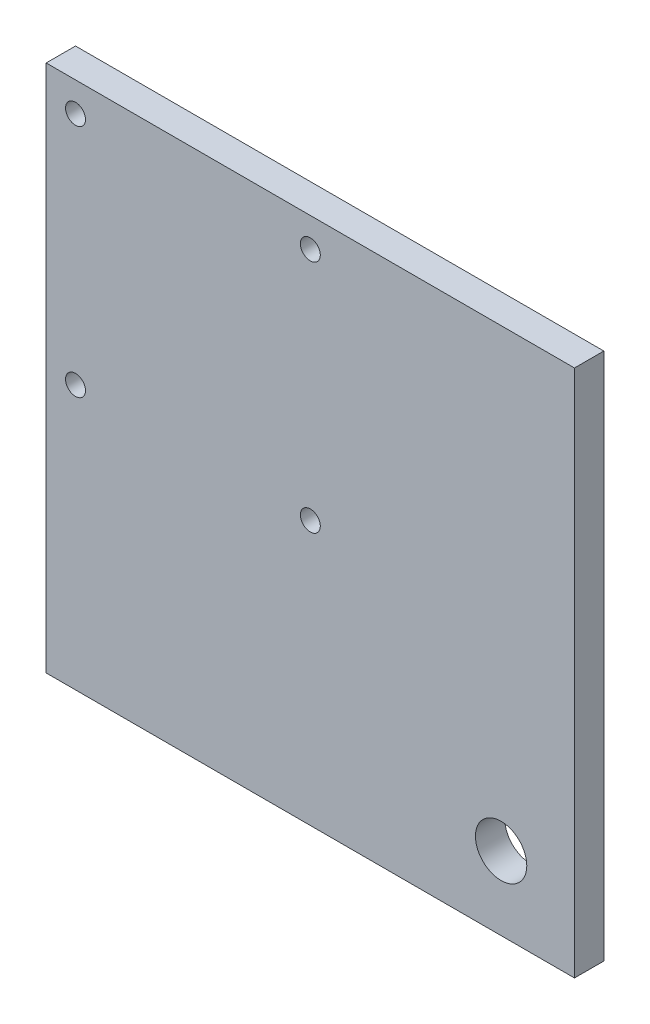
ISO-10303-21;
HEADER;
FILE_DESCRIPTION(('STEP AP214'),'2;1');
FILE_NAME('part.step','',(''),(''),'','','');
FILE_SCHEMA(('AUTOMOTIVE_DESIGN { 1 0 10303 214 1 1 1 1 }'));
ENDSEC;
DATA;
#1=APPLICATION_CONTEXT('core data for automotive mechanical design processes');
#2=APPLICATION_PROTOCOL_DEFINITION('international standard','automotive_design',2000,#1);
#3=PRODUCT_CONTEXT('',#1,'mechanical');
#4=PRODUCT('Part','Part','',(#3));
#5=PRODUCT_RELATED_PRODUCT_CATEGORY('part','',(#4));
#6=PRODUCT_DEFINITION_FORMATION('','',#4);
#7=PRODUCT_DEFINITION_CONTEXT('part definition',#1,'design');
#8=PRODUCT_DEFINITION('design','',#6,#7);
#9=PRODUCT_DEFINITION_SHAPE('','',#8);
#10=(LENGTH_UNIT() NAMED_UNIT(*) SI_UNIT(.MILLI.,.METRE.));
#11=(NAMED_UNIT(*) PLANE_ANGLE_UNIT() SI_UNIT($,.RADIAN.));
#12=(NAMED_UNIT(*) SI_UNIT($,.STERADIAN.) SOLID_ANGLE_UNIT());
#13=UNCERTAINTY_MEASURE_WITH_UNIT(LENGTH_MEASURE(1.E-05),#10,'distance_accuracy_value','');
#14=(GEOMETRIC_REPRESENTATION_CONTEXT(3) GLOBAL_UNCERTAINTY_ASSIGNED_CONTEXT((#13)) GLOBAL_UNIT_ASSIGNED_CONTEXT((#10,
#11,#12)) REPRESENTATION_CONTEXT('',''));
#15=CARTESIAN_POINT('',(0.,0.,0.));
#16=DIRECTION('',(0.,0.,1.));
#17=DIRECTION('',(1.,0.,0.));
#18=AXIS2_PLACEMENT_3D('',#15,#16,#17);
#19=CARTESIAN_POINT('',(0.,0.,10.));
#20=DIRECTION('',(0.,0.,1.));
#21=DIRECTION('',(1.,0.,0.));
#22=AXIS2_PLACEMENT_3D('',#19,#20,#21);
#23=PLANE('',#22);
#24=CARTESIAN_POINT('',(-145.,-79.9999999999994,10.));
#25=DIRECTION('',(0.,0.,1.));
#26=DIRECTION('',(1.,0.,0.));
#27=AXIS2_PLACEMENT_3D('',#24,#25,#26);
#28=CIRCLE('',#27,3.4);
#29=CARTESIAN_POINT('',(-141.6,-79.9999999999994,10.));
#30=VERTEX_POINT('',#29);
#31=EDGE_CURVE('E150',#30,#30,#28,.T.);
#32=ORIENTED_EDGE('',*,*,#31,.F.);
#33=EDGE_LOOP('',(#32));
#34=FACE_BOUND('',#33,.T.);
#35=CARTESIAN_POINT('',(-65.0000000000001,-159.999999999999,10.));
#36=DIRECTION('',(0.,0.,1.));
#37=DIRECTION('',(1.,0.,0.));
#38=AXIS2_PLACEMENT_3D('',#35,#36,#37);
#39=CIRCLE('',#38,3.39999999999998);
#40=CARTESIAN_POINT('',(-61.6000000000002,-159.999999999999,10.));
#41=VERTEX_POINT('',#40);
#42=EDGE_CURVE('E134',#41,#41,#39,.T.);
#43=ORIENTED_EDGE('',*,*,#42,.F.);
#44=EDGE_LOOP('',(#43));
#45=FACE_BOUND('',#44,.T.);
#46=DIRECTION('',(1.,0.,0.));
#47=VECTOR('',#46,1.);
#48=CARTESIAN_POINT('',(-155.,-250.,10.));
#49=LINE('',#48,#47);
#50=CARTESIAN_POINT('',(-155.,-250.,10.));
#51=VERTEX_POINT('',#50);
#52=CARTESIAN_POINT('',(25.,-250.,10.));
#53=VERTEX_POINT('',#52);
#54=EDGE_CURVE('E92',#51,#53,#49,.T.);
#55=ORIENTED_EDGE('',*,*,#54,.T.);
#56=DIRECTION('',(0.,1.,0.));
#57=VECTOR('',#56,1.);
#58=CARTESIAN_POINT('',(25.,-250.,10.));
#59=LINE('',#58,#57);
#60=CARTESIAN_POINT('',(25.,-69.9999999999994,10.));
#61=VERTEX_POINT('',#60);
#62=EDGE_CURVE('E87',#53,#61,#59,.T.);
#63=ORIENTED_EDGE('',*,*,#62,.T.);
#64=DIRECTION('',(-1.,0.,0.));
#65=VECTOR('',#64,1.);
#66=CARTESIAN_POINT('',(25.,-69.9999999999994,10.));
#67=LINE('',#66,#65);
#68=CARTESIAN_POINT('',(-155.,-69.9999999999994,10.));
#69=VERTEX_POINT('',#68);
#70=EDGE_CURVE('E90',#61,#69,#67,.T.);
#71=ORIENTED_EDGE('',*,*,#70,.T.);
#72=DIRECTION('',(0.,-1.,0.));
#73=VECTOR('',#72,1.);
#74=CARTESIAN_POINT('',(-155.,-69.9999999999994,10.));
#75=LINE('',#74,#73);
#76=EDGE_CURVE('E57',#69,#51,#75,.T.);
#77=ORIENTED_EDGE('',*,*,#76,.T.);
#78=EDGE_LOOP('',(#55,#63,#71,#77));
#79=FACE_BOUND('',#78,.T.);
#80=CARTESIAN_POINT('',(-145.,-159.999999999999,10.));
#81=DIRECTION('',(0.,0.,1.));
#82=DIRECTION('',(1.,0.,0.));
#83=AXIS2_PLACEMENT_3D('',#80,#81,#82);
#84=CIRCLE('',#83,3.39999999999999);
#85=CARTESIAN_POINT('',(-141.6,-159.999999999999,10.));
#86=VERTEX_POINT('',#85);
#87=EDGE_CURVE('E112',#86,#86,#84,.T.);
#88=ORIENTED_EDGE('',*,*,#87,.F.);
#89=EDGE_LOOP('',(#88));
#90=FACE_BOUND('',#89,.T.);
#91=CARTESIAN_POINT('',(0.,-225.,10.));
#92=DIRECTION('',(0.,0.,1.));
#93=DIRECTION('',(1.,0.,0.));
#94=AXIS2_PLACEMENT_3D('',#91,#92,#93);
#95=CIRCLE('',#94,8.74999999999999);
#96=CARTESIAN_POINT('',(8.75000000000007,-225.,10.));
#97=VERTEX_POINT('',#96);
#98=EDGE_CURVE('E142',#97,#97,#95,.T.);
#99=ORIENTED_EDGE('',*,*,#98,.F.);
#100=EDGE_LOOP('',(#99));
#101=FACE_BOUND('',#100,.T.);
#102=CARTESIAN_POINT('',(-65.0000000000001,-79.9999999999994,10.));
#103=DIRECTION('',(0.,0.,1.));
#104=DIRECTION('',(1.,0.,0.));
#105=AXIS2_PLACEMENT_3D('',#102,#103,#104);
#106=CIRCLE('',#105,3.39999999999999);
#107=CARTESIAN_POINT('',(-61.6000000000002,-79.9999999999994,10.));
#108=VERTEX_POINT('',#107);
#109=EDGE_CURVE('E158',#108,#108,#106,.T.);
#110=ORIENTED_EDGE('',*,*,#109,.F.);
#111=EDGE_LOOP('',(#110));
#112=FACE_BOUND('',#111,.T.);
#113=ADVANCED_FACE('F39',(#34,#45,#79,#90,#101,#112),#23,.T.);
#114=CARTESIAN_POINT('',(0.,0.,0.));
#115=DIRECTION('',(0.,0.,1.));
#116=DIRECTION('',(1.,0.,0.));
#117=AXIS2_PLACEMENT_3D('',#114,#115,#116);
#118=PLANE('',#117);
#119=DIRECTION('',(1.,0.,0.));
#120=VECTOR('',#119,1.);
#121=CARTESIAN_POINT('',(-155.,-250.,0.));
#122=LINE('',#121,#120);
#123=CARTESIAN_POINT('',(-155.,-250.,0.));
#124=VERTEX_POINT('',#123);
#125=CARTESIAN_POINT('',(25.,-250.,0.));
#126=VERTEX_POINT('',#125);
#127=EDGE_CURVE('E108',#124,#126,#122,.T.);
#128=ORIENTED_EDGE('',*,*,#127,.F.);
#129=DIRECTION('',(0.,-1.,0.));
#130=VECTOR('',#129,1.);
#131=CARTESIAN_POINT('',(-155.,-69.9999999999994,0.));
#132=LINE('',#131,#130);
#133=CARTESIAN_POINT('',(-155.,-69.9999999999994,0.));
#134=VERTEX_POINT('',#133);
#135=EDGE_CURVE('E80',#134,#124,#132,.T.);
#136=ORIENTED_EDGE('',*,*,#135,.F.);
#137=DIRECTION('',(-1.,0.,0.));
#138=VECTOR('',#137,1.);
#139=CARTESIAN_POINT('',(25.,-69.9999999999994,0.));
#140=LINE('',#139,#138);
#141=CARTESIAN_POINT('',(25.,-69.9999999999994,0.));
#142=VERTEX_POINT('',#141);
#143=EDGE_CURVE('E74',#142,#134,#140,.T.);
#144=ORIENTED_EDGE('',*,*,#143,.F.);
#145=DIRECTION('',(0.,1.,0.));
#146=VECTOR('',#145,1.);
#147=CARTESIAN_POINT('',(25.,-250.,0.));
#148=LINE('',#147,#146);
#149=EDGE_CURVE('E97',#126,#142,#148,.T.);
#150=ORIENTED_EDGE('',*,*,#149,.F.);
#151=EDGE_LOOP('',(#128,#136,#144,#150));
#152=FACE_BOUND('',#151,.T.);
#153=CARTESIAN_POINT('',(-145.,-159.999999999999,0.));
#154=DIRECTION('',(0.,0.,1.));
#155=DIRECTION('',(1.,0.,0.));
#156=AXIS2_PLACEMENT_3D('',#153,#154,#155);
#157=CIRCLE('',#156,3.39999999999999);
#158=CARTESIAN_POINT('',(-141.6,-159.999999999999,0.));
#159=VERTEX_POINT('',#158);
#160=EDGE_CURVE('E130',#159,#159,#157,.T.);
#161=ORIENTED_EDGE('',*,*,#160,.T.);
#162=EDGE_LOOP('',(#161));
#163=FACE_BOUND('',#162,.T.);
#164=CARTESIAN_POINT('',(-65.0000000000001,-159.999999999999,0.));
#165=DIRECTION('',(0.,0.,1.));
#166=DIRECTION('',(1.,0.,0.));
#167=AXIS2_PLACEMENT_3D('',#164,#165,#166);
#168=CIRCLE('',#167,3.39999999999998);
#169=CARTESIAN_POINT('',(-61.6000000000002,-159.999999999999,0.));
#170=VERTEX_POINT('',#169);
#171=EDGE_CURVE('E138',#170,#170,#168,.T.);
#172=ORIENTED_EDGE('',*,*,#171,.T.);
#173=EDGE_LOOP('',(#172));
#174=FACE_BOUND('',#173,.T.);
#175=CARTESIAN_POINT('',(0.,-225.,0.));
#176=DIRECTION('',(0.,0.,1.));
#177=DIRECTION('',(1.,0.,0.));
#178=AXIS2_PLACEMENT_3D('',#175,#176,#177);
#179=CIRCLE('',#178,8.74999999999999);
#180=CARTESIAN_POINT('',(8.75000000000007,-225.,0.));
#181=VERTEX_POINT('',#180);
#182=EDGE_CURVE('E146',#181,#181,#179,.T.);
#183=ORIENTED_EDGE('',*,*,#182,.T.);
#184=EDGE_LOOP('',(#183));
#185=FACE_BOUND('',#184,.T.);
#186=CARTESIAN_POINT('',(-145.,-79.9999999999994,0.));
#187=DIRECTION('',(0.,0.,1.));
#188=DIRECTION('',(1.,0.,0.));
#189=AXIS2_PLACEMENT_3D('',#186,#187,#188);
#190=CIRCLE('',#189,3.4);
#191=CARTESIAN_POINT('',(-141.6,-79.9999999999994,0.));
#192=VERTEX_POINT('',#191);
#193=EDGE_CURVE('E154',#192,#192,#190,.T.);
#194=ORIENTED_EDGE('',*,*,#193,.T.);
#195=EDGE_LOOP('',(#194));
#196=FACE_BOUND('',#195,.T.);
#197=CARTESIAN_POINT('',(-65.0000000000001,-79.9999999999994,0.));
#198=DIRECTION('',(0.,0.,1.));
#199=DIRECTION('',(1.,0.,0.));
#200=AXIS2_PLACEMENT_3D('',#197,#198,#199);
#201=CIRCLE('',#200,3.39999999999999);
#202=CARTESIAN_POINT('',(-61.6000000000002,-79.9999999999994,0.));
#203=VERTEX_POINT('',#202);
#204=EDGE_CURVE('E162',#203,#203,#201,.T.);
#205=ORIENTED_EDGE('',*,*,#204,.T.);
#206=EDGE_LOOP('',(#205));
#207=FACE_BOUND('',#206,.T.);
#208=ADVANCED_FACE('F125',(#152,#163,#174,#185,#196,#207),#118,.F.);
#209=CARTESIAN_POINT('',(-155.,-250.,10.));
#210=DIRECTION('',(0.,1.,0.));
#211=DIRECTION('',(0.,0.,1.));
#212=AXIS2_PLACEMENT_3D('',#209,#210,#211);
#213=PLANE('',#212);
#214=ORIENTED_EDGE('',*,*,#127,.T.);
#215=DIRECTION('',(0.,0.,-1.));
#216=VECTOR('',#215,1.);
#217=CARTESIAN_POINT('',(25.,-250.,10.));
#218=LINE('',#217,#216);
#219=EDGE_CURVE('E11',#53,#126,#218,.T.);
#220=ORIENTED_EDGE('',*,*,#219,.F.);
#221=ORIENTED_EDGE('',*,*,#54,.F.);
#222=DIRECTION('',(0.,0.,-1.));
#223=VECTOR('',#222,1.);
#224=CARTESIAN_POINT('',(-155.,-250.,10.));
#225=LINE('',#224,#223);
#226=EDGE_CURVE('E104',#51,#124,#225,.T.);
#227=ORIENTED_EDGE('',*,*,#226,.T.);
#228=EDGE_LOOP('',(#214,#220,#221,#227));
#229=FACE_BOUND('',#228,.T.);
#230=ADVANCED_FACE('F41',(#229),#213,.F.);
#231=CARTESIAN_POINT('',(25.,-250.,10.));
#232=DIRECTION('',(-1.,0.,0.));
#233=DIRECTION('',(0.,-1.,0.));
#234=AXIS2_PLACEMENT_3D('',#231,#232,#233);
#235=PLANE('',#234);
#236=ORIENTED_EDGE('',*,*,#149,.T.);
#237=DIRECTION('',(0.,0.,-1.));
#238=VECTOR('',#237,1.);
#239=CARTESIAN_POINT('',(25.,-69.9999999999994,10.));
#240=LINE('',#239,#238);
#241=EDGE_CURVE('E49',#61,#142,#240,.T.);
#242=ORIENTED_EDGE('',*,*,#241,.F.);
#243=ORIENTED_EDGE('',*,*,#62,.F.);
#244=ORIENTED_EDGE('',*,*,#219,.T.);
#245=EDGE_LOOP('',(#236,#242,#243,#244));
#246=FACE_BOUND('',#245,.T.);
#247=ADVANCED_FACE('F96',(#246),#235,.F.);
#248=CARTESIAN_POINT('',(25.,-69.9999999999994,10.));
#249=DIRECTION('',(0.,-1.,0.));
#250=DIRECTION('',(0.,0.,-1.));
#251=AXIS2_PLACEMENT_3D('',#248,#249,#250);
#252=PLANE('',#251);
#253=ORIENTED_EDGE('',*,*,#143,.T.);
#254=DIRECTION('',(0.,0.,-1.));
#255=VECTOR('',#254,1.);
#256=CARTESIAN_POINT('',(-155.,-69.9999999999994,10.));
#257=LINE('',#256,#255);
#258=EDGE_CURVE('E99',#69,#134,#257,.T.);
#259=ORIENTED_EDGE('',*,*,#258,.F.);
#260=ORIENTED_EDGE('',*,*,#70,.F.);
#261=ORIENTED_EDGE('',*,*,#241,.T.);
#262=EDGE_LOOP('',(#253,#259,#260,#261));
#263=FACE_BOUND('',#262,.T.);
#264=ADVANCED_FACE('F100',(#263),#252,.F.);
#265=CARTESIAN_POINT('',(-155.,-69.9999999999994,10.));
#266=DIRECTION('',(1.,0.,0.));
#267=DIRECTION('',(0.,1.,0.));
#268=AXIS2_PLACEMENT_3D('',#265,#266,#267);
#269=PLANE('',#268);
#270=ORIENTED_EDGE('',*,*,#135,.T.);
#271=ORIENTED_EDGE('',*,*,#226,.F.);
#272=ORIENTED_EDGE('',*,*,#76,.F.);
#273=ORIENTED_EDGE('',*,*,#258,.T.);
#274=EDGE_LOOP('',(#270,#271,#272,#273));
#275=FACE_BOUND('',#274,.T.);
#276=ADVANCED_FACE('F122',(#275),#269,.F.);
#277=CARTESIAN_POINT('',(-145.,-159.999999999999,10.));
#278=DIRECTION('',(0.,0.,-1.));
#279=DIRECTION('',(-1.,0.,0.));
#280=AXIS2_PLACEMENT_3D('',#277,#278,#279);
#281=CYLINDRICAL_SURFACE('',#280,3.39999999999999);
#282=ORIENTED_EDGE('',*,*,#87,.T.);
#283=EDGE_LOOP('',(#282));
#284=FACE_BOUND('',#283,.T.);
#285=ORIENTED_EDGE('',*,*,#160,.F.);
#286=EDGE_LOOP('',(#285));
#287=FACE_BOUND('',#286,.T.);
#288=ADVANCED_FACE('F183',(#284,#287),#281,.F.);
#289=CARTESIAN_POINT('',(-65.0000000000001,-159.999999999999,10.));
#290=DIRECTION('',(0.,0.,-1.));
#291=DIRECTION('',(-1.,0.,0.));
#292=AXIS2_PLACEMENT_3D('',#289,#290,#291);
#293=CYLINDRICAL_SURFACE('',#292,3.39999999999998);
#294=ORIENTED_EDGE('',*,*,#42,.T.);
#295=EDGE_LOOP('',(#294));
#296=FACE_BOUND('',#295,.T.);
#297=ORIENTED_EDGE('',*,*,#171,.F.);
#298=EDGE_LOOP('',(#297));
#299=FACE_BOUND('',#298,.T.);
#300=ADVANCED_FACE('F229',(#296,#299),#293,.F.);
#301=CARTESIAN_POINT('',(0.,-225.,10.));
#302=DIRECTION('',(0.,0.,-1.));
#303=DIRECTION('',(-1.,0.,0.));
#304=AXIS2_PLACEMENT_3D('',#301,#302,#303);
#305=CYLINDRICAL_SURFACE('',#304,8.74999999999999);
#306=ORIENTED_EDGE('',*,*,#98,.T.);
#307=EDGE_LOOP('',(#306));
#308=FACE_BOUND('',#307,.T.);
#309=ORIENTED_EDGE('',*,*,#182,.F.);
#310=EDGE_LOOP('',(#309));
#311=FACE_BOUND('',#310,.T.);
#312=ADVANCED_FACE('F237',(#308,#311),#305,.F.);
#313=CARTESIAN_POINT('',(-145.,-79.9999999999994,10.));
#314=DIRECTION('',(0.,0.,-1.));
#315=DIRECTION('',(-1.,0.,0.));
#316=AXIS2_PLACEMENT_3D('',#313,#314,#315);
#317=CYLINDRICAL_SURFACE('',#316,3.4);
#318=ORIENTED_EDGE('',*,*,#31,.T.);
#319=EDGE_LOOP('',(#318));
#320=FACE_BOUND('',#319,.T.);
#321=ORIENTED_EDGE('',*,*,#193,.F.);
#322=EDGE_LOOP('',(#321));
#323=FACE_BOUND('',#322,.T.);
#324=ADVANCED_FACE('F245',(#320,#323),#317,.F.);
#325=CARTESIAN_POINT('',(-65.0000000000001,-79.9999999999994,10.));
#326=DIRECTION('',(0.,0.,-1.));
#327=DIRECTION('',(-1.,0.,0.));
#328=AXIS2_PLACEMENT_3D('',#325,#326,#327);
#329=CYLINDRICAL_SURFACE('',#328,3.39999999999999);
#330=ORIENTED_EDGE('',*,*,#109,.T.);
#331=EDGE_LOOP('',(#330));
#332=FACE_BOUND('',#331,.T.);
#333=ORIENTED_EDGE('',*,*,#204,.F.);
#334=EDGE_LOOP('',(#333));
#335=FACE_BOUND('',#334,.T.);
#336=ADVANCED_FACE('F170',(#332,#335),#329,.F.);
#337=CLOSED_SHELL('',(#113,#208,#230,#247,#264,#276,#288,#300,#312,#324,#336));
#338=MANIFOLD_SOLID_BREP('B2',#337);
#339=ADVANCED_BREP_SHAPE_REPRESENTATION('',(#18,#338),#14);
#340=SHAPE_DEFINITION_REPRESENTATION(#9,#339);
ENDSEC;
END-ISO-10303-21;
